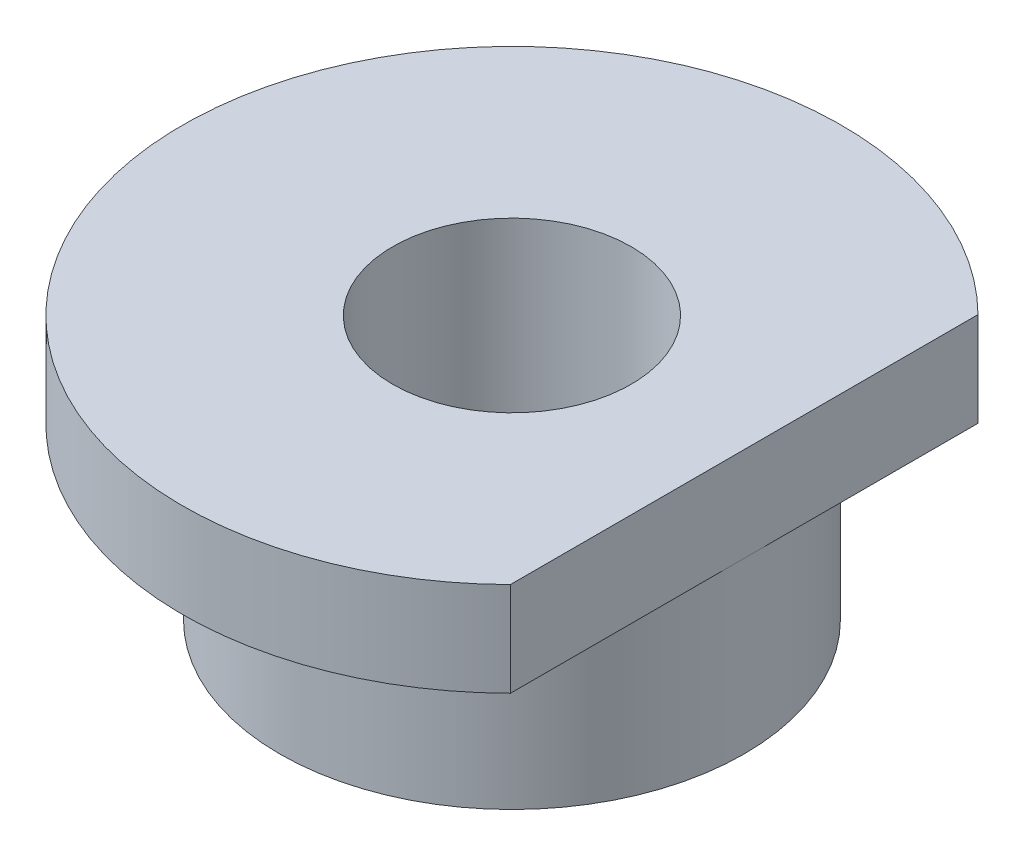
ISO-10303-21;
HEADER;
FILE_DESCRIPTION(('STEP AP214'),'2;1');
FILE_NAME('part.step','',(''),(''),'','','');
FILE_SCHEMA(('AUTOMOTIVE_DESIGN { 1 0 10303 214 1 1 1 1 }'));
ENDSEC;
DATA;
#1=APPLICATION_CONTEXT('core data for automotive mechanical design processes');
#2=APPLICATION_PROTOCOL_DEFINITION('international standard','automotive_design',2000,#1);
#3=PRODUCT_CONTEXT('',#1,'mechanical');
#4=PRODUCT('Part','Part','',(#3));
#5=PRODUCT_RELATED_PRODUCT_CATEGORY('part','',(#4));
#6=PRODUCT_DEFINITION_FORMATION('','',#4);
#7=PRODUCT_DEFINITION_CONTEXT('part definition',#1,'design');
#8=PRODUCT_DEFINITION('design','',#6,#7);
#9=PRODUCT_DEFINITION_SHAPE('','',#8);
#10=(LENGTH_UNIT() NAMED_UNIT(*) SI_UNIT(.MILLI.,.METRE.));
#11=(NAMED_UNIT(*) PLANE_ANGLE_UNIT() SI_UNIT($,.RADIAN.));
#12=(NAMED_UNIT(*) SI_UNIT($,.STERADIAN.) SOLID_ANGLE_UNIT());
#13=UNCERTAINTY_MEASURE_WITH_UNIT(LENGTH_MEASURE(1.E-05),#10,'distance_accuracy_value','');
#14=(GEOMETRIC_REPRESENTATION_CONTEXT(3) GLOBAL_UNCERTAINTY_ASSIGNED_CONTEXT((#13)) GLOBAL_UNIT_ASSIGNED_CONTEXT((#10,
#11,#12)) REPRESENTATION_CONTEXT('',''));
#15=CARTESIAN_POINT('',(0.,0.,0.));
#16=DIRECTION('',(0.,0.,1.));
#17=DIRECTION('',(1.,0.,0.));
#18=AXIS2_PLACEMENT_3D('',#15,#16,#17);
#19=CARTESIAN_POINT('',(0.,0.,0.));
#20=DIRECTION('',(0.,-1.,0.));
#21=DIRECTION('',(0.,0.,-1.));
#22=AXIS2_PLACEMENT_3D('',#19,#20,#21);
#23=CYLINDRICAL_SURFACE('',#22,3.7);
#24=CARTESIAN_POINT('',(0.,0.,0.));
#25=DIRECTION('',(0.,-1.,0.));
#26=DIRECTION('',(0.,0.,-1.));
#27=AXIS2_PLACEMENT_3D('',#24,#25,#26);
#28=CIRCLE('',#27,3.7);
#29=CARTESIAN_POINT('',(0.,0.,-3.7));
#30=VERTEX_POINT('',#29);
#31=EDGE_CURVE('E58',#30,#30,#28,.F.);
#32=ORIENTED_EDGE('',*,*,#31,.T.);
#33=EDGE_LOOP('',(#32));
#34=FACE_BOUND('',#33,.T.);
#35=CARTESIAN_POINT('',(0.,2.7,0.));
#36=DIRECTION('',(0.,-1.,0.));
#37=DIRECTION('',(0.,0.,-1.));
#38=AXIS2_PLACEMENT_3D('',#35,#36,#37);
#39=CIRCLE('',#38,3.7);
#40=CARTESIAN_POINT('',(0.,2.7,-3.7));
#41=VERTEX_POINT('',#40);
#42=EDGE_CURVE('E20',#41,#41,#39,.T.);
#43=ORIENTED_EDGE('',*,*,#42,.T.);
#44=EDGE_LOOP('',(#43));
#45=FACE_BOUND('',#44,.T.);
#46=ADVANCED_FACE('F17',(#34,#45),#23,.T.);
#47=CARTESIAN_POINT('',(-5.25,2.7,0.));
#48=DIRECTION('',(0.,1.,0.));
#49=DIRECTION('',(0.,0.,1.));
#50=AXIS2_PLACEMENT_3D('',#47,#48,#49);
#51=PLANE('',#50);
#52=ORIENTED_EDGE('',*,*,#42,.F.);
#53=EDGE_LOOP('',(#52));
#54=FACE_BOUND('',#53,.T.);
#55=CARTESIAN_POINT('',(0.,2.7,0.));
#56=DIRECTION('',(0.,-1.,0.));
#57=DIRECTION('',(0.,0.,-1.));
#58=AXIS2_PLACEMENT_3D('',#55,#56,#57);
#59=CIRCLE('',#58,5.25);
#60=CARTESIAN_POINT('',(3.7,2.7,-3.72458051329274));
#61=VERTEX_POINT('',#60);
#62=CARTESIAN_POINT('',(3.7,2.7,3.72458051329274));
#63=VERTEX_POINT('',#62);
#64=EDGE_CURVE('E42',#61,#63,#59,.F.);
#65=ORIENTED_EDGE('',*,*,#64,.F.);
#66=DIRECTION('',(0.,0.,1.));
#67=VECTOR('',#66,1.);
#68=CARTESIAN_POINT('',(3.7,2.7,0.));
#69=LINE('',#68,#67);
#70=EDGE_CURVE('E47',#61,#63,#69,.T.);
#71=ORIENTED_EDGE('',*,*,#70,.T.);
#72=EDGE_LOOP('',(#65,#71));
#73=FACE_BOUND('',#72,.T.);
#74=ADVANCED_FACE('F46',(#54,#73),#51,.F.);
#75=CARTESIAN_POINT('',(-3.7,0.,0.));
#76=DIRECTION('',(0.,1.,0.));
#77=DIRECTION('',(0.,0.,1.));
#78=AXIS2_PLACEMENT_3D('',#75,#76,#77);
#79=PLANE('',#78);
#80=ORIENTED_EDGE('',*,*,#31,.F.);
#81=EDGE_LOOP('',(#80));
#82=FACE_BOUND('',#81,.T.);
#83=CARTESIAN_POINT('',(0.,0.,0.));
#84=DIRECTION('',(0.,-1.,0.));
#85=DIRECTION('',(0.,0.,-1.));
#86=AXIS2_PLACEMENT_3D('',#83,#84,#85);
#87=CIRCLE('',#86,1.9);
#88=CARTESIAN_POINT('',(0.,0.,-1.9));
#89=VERTEX_POINT('',#88);
#90=EDGE_CURVE('E65',#89,#89,#87,.F.);
#91=ORIENTED_EDGE('',*,*,#90,.T.);
#92=EDGE_LOOP('',(#91));
#93=FACE_BOUND('',#92,.T.);
#94=ADVANCED_FACE('F86',(#82,#93),#79,.F.);
#95=CARTESIAN_POINT('',(3.7,12.7,3.72458051329274));
#96=DIRECTION('',(-1.,0.,0.));
#97=DIRECTION('',(0.,0.,1.));
#98=AXIS2_PLACEMENT_3D('',#95,#96,#97);
#99=PLANE('',#98);
#100=ORIENTED_EDGE('',*,*,#70,.F.);
#101=DIRECTION('',(0.,1.,0.));
#102=VECTOR('',#101,1.);
#103=CARTESIAN_POINT('',(3.7,12.7,-3.72458051329274));
#104=LINE('',#103,#102);
#105=CARTESIAN_POINT('',(3.7,4.2,-3.72458051329274));
#106=VERTEX_POINT('',#105);
#107=EDGE_CURVE('E55',#106,#61,#104,.F.);
#108=ORIENTED_EDGE('',*,*,#107,.F.);
#109=DIRECTION('',(0.,0.,-1.));
#110=VECTOR('',#109,1.);
#111=CARTESIAN_POINT('',(3.7,4.2,0.));
#112=LINE('',#111,#110);
#113=CARTESIAN_POINT('',(3.7,4.2,3.72458051329274));
#114=VERTEX_POINT('',#113);
#115=EDGE_CURVE('E26',#106,#114,#112,.F.);
#116=ORIENTED_EDGE('',*,*,#115,.T.);
#117=DIRECTION('',(0.,-1.,0.));
#118=VECTOR('',#117,1.);
#119=CARTESIAN_POINT('',(3.7,0.,3.72458051329274));
#120=LINE('',#119,#118);
#121=EDGE_CURVE('E49',#63,#114,#120,.F.);
#122=ORIENTED_EDGE('',*,*,#121,.F.);
#123=EDGE_LOOP('',(#100,#108,#116,#122));
#124=FACE_BOUND('',#123,.T.);
#125=ADVANCED_FACE('F53',(#124),#99,.F.);
#126=CARTESIAN_POINT('',(0.,0.,0.));
#127=DIRECTION('',(0.,-1.,0.));
#128=DIRECTION('',(0.,0.,-1.));
#129=AXIS2_PLACEMENT_3D('',#126,#127,#128);
#130=CYLINDRICAL_SURFACE('',#129,5.25);
#131=ORIENTED_EDGE('',*,*,#64,.T.);
#132=ORIENTED_EDGE('',*,*,#121,.T.);
#133=CARTESIAN_POINT('',(0.,4.2,0.));
#134=DIRECTION('',(0.,-1.,0.));
#135=DIRECTION('',(0.,0.,-1.));
#136=AXIS2_PLACEMENT_3D('',#133,#134,#135);
#137=CIRCLE('',#136,5.25);
#138=EDGE_CURVE('E34',#114,#106,#137,.T.);
#139=ORIENTED_EDGE('',*,*,#138,.T.);
#140=ORIENTED_EDGE('',*,*,#107,.T.);
#141=EDGE_LOOP('',(#131,#132,#139,#140));
#142=FACE_BOUND('',#141,.T.);
#143=ADVANCED_FACE('F57',(#142),#130,.T.);
#144=CARTESIAN_POINT('',(0.,0.,0.));
#145=DIRECTION('',(0.,-1.,0.));
#146=DIRECTION('',(0.,0.,-1.));
#147=AXIS2_PLACEMENT_3D('',#144,#145,#146);
#148=CYLINDRICAL_SURFACE('',#147,1.9);
#149=CARTESIAN_POINT('',(0.,4.2,0.));
#150=DIRECTION('',(0.,-1.,0.));
#151=DIRECTION('',(0.,0.,-1.));
#152=AXIS2_PLACEMENT_3D('',#149,#150,#151);
#153=CIRCLE('',#152,1.9);
#154=CARTESIAN_POINT('',(0.,4.2,-1.9));
#155=VERTEX_POINT('',#154);
#156=EDGE_CURVE('E11',#155,#155,#153,.F.);
#157=ORIENTED_EDGE('',*,*,#156,.T.);
#158=EDGE_LOOP('',(#157));
#159=FACE_BOUND('',#158,.T.);
#160=ORIENTED_EDGE('',*,*,#90,.F.);
#161=EDGE_LOOP('',(#160));
#162=FACE_BOUND('',#161,.T.);
#163=ADVANCED_FACE('F71',(#159,#162),#148,.F.);
#164=CARTESIAN_POINT('',(-1.9,4.2,0.));
#165=DIRECTION('',(0.,-1.,0.));
#166=DIRECTION('',(0.,0.,-1.));
#167=AXIS2_PLACEMENT_3D('',#164,#165,#166);
#168=PLANE('',#167);
#169=ORIENTED_EDGE('',*,*,#156,.F.);
#170=EDGE_LOOP('',(#169));
#171=FACE_BOUND('',#170,.T.);
#172=ORIENTED_EDGE('',*,*,#115,.F.);
#173=ORIENTED_EDGE('',*,*,#138,.F.);
#174=EDGE_LOOP('',(#172,#173));
#175=FACE_BOUND('',#174,.T.);
#176=ADVANCED_FACE('F69',(#171,#175),#168,.F.);
#177=CLOSED_SHELL('',(#46,#74,#94,#125,#143,#163,#176));
#178=MANIFOLD_SOLID_BREP('B1',#177);
#179=ADVANCED_BREP_SHAPE_REPRESENTATION('',(#18,#178),#14);
#180=SHAPE_DEFINITION_REPRESENTATION(#9,#179);
ENDSEC;
END-ISO-10303-21;
